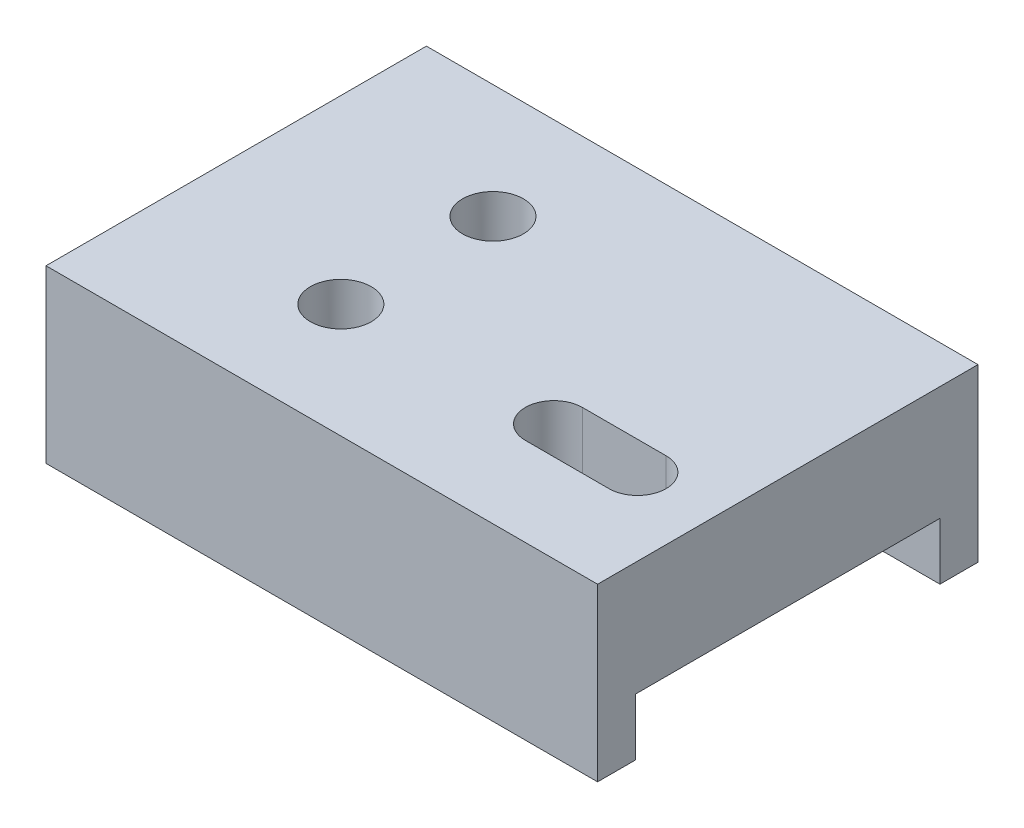
ISO-10303-21;
HEADER;
FILE_DESCRIPTION(('STEP AP214'),'2;1');
FILE_NAME('part.step','',(''),(''),'','','');
FILE_SCHEMA(('AUTOMOTIVE_DESIGN { 1 0 10303 214 1 1 1 1 }'));
ENDSEC;
DATA;
#1=APPLICATION_CONTEXT('core data for automotive mechanical design processes');
#2=APPLICATION_PROTOCOL_DEFINITION('international standard','automotive_design',2000,#1);
#3=PRODUCT_CONTEXT('',#1,'mechanical');
#4=PRODUCT('Part','Part','',(#3));
#5=PRODUCT_RELATED_PRODUCT_CATEGORY('part','',(#4));
#6=PRODUCT_DEFINITION_FORMATION('','',#4);
#7=PRODUCT_DEFINITION_CONTEXT('part definition',#1,'design');
#8=PRODUCT_DEFINITION('design','',#6,#7);
#9=PRODUCT_DEFINITION_SHAPE('','',#8);
#10=(LENGTH_UNIT() NAMED_UNIT(*) SI_UNIT(.MILLI.,.METRE.));
#11=(NAMED_UNIT(*) PLANE_ANGLE_UNIT() SI_UNIT($,.RADIAN.));
#12=(NAMED_UNIT(*) SI_UNIT($,.STERADIAN.) SOLID_ANGLE_UNIT());
#13=UNCERTAINTY_MEASURE_WITH_UNIT(LENGTH_MEASURE(1.E-05),#10,'distance_accuracy_value','');
#14=(GEOMETRIC_REPRESENTATION_CONTEXT(3) GLOBAL_UNCERTAINTY_ASSIGNED_CONTEXT((#13)) GLOBAL_UNIT_ASSIGNED_CONTEXT((#10,
#11,#12)) REPRESENTATION_CONTEXT('',''));
#15=CARTESIAN_POINT('',(0.,0.,0.));
#16=DIRECTION('',(0.,0.,1.));
#17=DIRECTION('',(1.,0.,0.));
#18=AXIS2_PLACEMENT_3D('',#15,#16,#17);
#19=CARTESIAN_POINT('',(11.0500000000395,0.,-6.14999999999984));
#20=DIRECTION('',(0.,-1.,0.));
#21=DIRECTION('',(0.,0.,-1.));
#22=AXIS2_PLACEMENT_3D('',#19,#20,#21);
#23=CYLINDRICAL_SURFACE('',#22,1.5);
#24=DIRECTION('',(0.,-1.,0.));
#25=VECTOR('',#24,1.);
#26=CARTESIAN_POINT('',(11.0500000000395,0.,-4.64999999999984));
#27=LINE('',#26,#25);
#28=CARTESIAN_POINT('',(11.0500000000395,0.,-4.64999999999984));
#29=VERTEX_POINT('',#28);
#30=CARTESIAN_POINT('',(11.0500000000395,-6.,-4.64999999999984));
#31=VERTEX_POINT('',#30);
#32=EDGE_CURVE('E156',#29,#31,#27,.T.);
#33=ORIENTED_EDGE('',*,*,#32,.T.);
#34=CARTESIAN_POINT('',(11.0500000000395,-6.,-6.14999999999984));
#35=DIRECTION('',(0.,-1.,0.));
#36=DIRECTION('',(0.,0.,-1.));
#37=AXIS2_PLACEMENT_3D('',#34,#35,#36);
#38=CIRCLE('',#37,1.5);
#39=CARTESIAN_POINT('',(11.0500000000395,-6.,-7.64999999999984));
#40=VERTEX_POINT('',#39);
#41=EDGE_CURVE('E159',#31,#40,#38,.T.);
#42=ORIENTED_EDGE('',*,*,#41,.T.);
#43=DIRECTION('',(0.,-1.,0.));
#44=VECTOR('',#43,1.);
#45=CARTESIAN_POINT('',(11.0500000000395,0.,-7.64999999999984));
#46=LINE('',#45,#44);
#47=CARTESIAN_POINT('',(11.0500000000395,0.,-7.64999999999984));
#48=VERTEX_POINT('',#47);
#49=EDGE_CURVE('E130',#48,#40,#46,.T.);
#50=ORIENTED_EDGE('',*,*,#49,.F.);
#51=CARTESIAN_POINT('',(11.0500000000395,0.,-6.14999999999984));
#52=DIRECTION('',(0.,-1.,0.));
#53=DIRECTION('',(0.,0.,-1.));
#54=AXIS2_PLACEMENT_3D('',#51,#52,#53);
#55=CIRCLE('',#54,1.5);
#56=EDGE_CURVE('E144',#29,#48,#55,.T.);
#57=ORIENTED_EDGE('',*,*,#56,.F.);
#58=EDGE_LOOP('',(#33,#42,#50,#57));
#59=FACE_BOUND('',#58,.T.);
#60=ADVANCED_FACE('F32',(#59),#23,.F.);
#61=CARTESIAN_POINT('',(9.5,-6.,-20.));
#62=DIRECTION('',(0.,-1.,0.));
#63=DIRECTION('',(0.,0.,-1.));
#64=AXIS2_PLACEMENT_3D('',#61,#62,#63);
#65=PLANE('',#64);
#66=CARTESIAN_POINT('',(0.,-6.,-6.00000000000006));
#67=DIRECTION('',(0.,-1.,0.));
#68=DIRECTION('',(0.,0.,-1.));
#69=AXIS2_PLACEMENT_3D('',#66,#67,#68);
#70=CIRCLE('',#69,3.);
#71=CARTESIAN_POINT('',(0.,-6.,-3.00000000000006));
#72=VERTEX_POINT('',#71);
#73=EDGE_CURVE('E36',#72,#72,#70,.T.);
#74=ORIENTED_EDGE('',*,*,#73,.F.);
#75=EDGE_LOOP('',(#74));
#76=FACE_BOUND('',#75,.T.);
#77=DIRECTION('',(-1.,0.,0.));
#78=VECTOR('',#77,1.);
#79=CARTESIAN_POINT('',(11.0500000000395,-6.,-4.64999999999984));
#80=LINE('',#79,#78);
#81=CARTESIAN_POINT('',(15.4500557523161,-6.,-4.64999999999984));
#82=VERTEX_POINT('',#81);
#83=EDGE_CURVE('E145',#82,#31,#80,.T.);
#84=ORIENTED_EDGE('',*,*,#83,.F.);
#85=CARTESIAN_POINT('',(15.4500557523161,-6.,-6.14999999999984));
#86=DIRECTION('',(0.,-1.,0.));
#87=DIRECTION('',(0.,0.,-1.));
#88=AXIS2_PLACEMENT_3D('',#85,#86,#87);
#89=CIRCLE('',#88,1.5);
#90=CARTESIAN_POINT('',(15.4500557523161,-6.,-7.64999999999984));
#91=VERTEX_POINT('',#90);
#92=EDGE_CURVE('E147',#91,#82,#89,.T.);
#93=ORIENTED_EDGE('',*,*,#92,.F.);
#94=DIRECTION('',(1.,0.,0.));
#95=VECTOR('',#94,1.);
#96=CARTESIAN_POINT('',(11.0500000000395,-6.,-7.64999999999984));
#97=LINE('',#96,#95);
#98=EDGE_CURVE('E125',#40,#91,#97,.T.);
#99=ORIENTED_EDGE('',*,*,#98,.F.);
#100=ORIENTED_EDGE('',*,*,#41,.F.);
#101=EDGE_LOOP('',(#84,#93,#99,#100));
#102=FACE_BOUND('',#101,.T.);
#103=CARTESIAN_POINT('',(0.,-6.,-14.0000000000001));
#104=DIRECTION('',(0.,-1.,0.));
#105=DIRECTION('',(0.,0.,-1.));
#106=AXIS2_PLACEMENT_3D('',#103,#104,#105);
#107=CIRCLE('',#106,3.);
#108=CARTESIAN_POINT('',(0.,-6.,-17.0000000000001));
#109=VERTEX_POINT('',#108);
#110=EDGE_CURVE('E220',#109,#109,#107,.T.);
#111=ORIENTED_EDGE('',*,*,#110,.F.);
#112=EDGE_LOOP('',(#111));
#113=FACE_BOUND('',#112,.T.);
#114=DIRECTION('',(0.,0.,1.));
#115=VECTOR('',#114,1.);
#116=CARTESIAN_POINT('',(-9.5,-6.,-20.));
#117=LINE('',#116,#115);
#118=CARTESIAN_POINT('',(-9.5,-6.,-18.));
#119=VERTEX_POINT('',#118);
#120=CARTESIAN_POINT('',(-9.5,-6.,-2.00000000000002));
#121=VERTEX_POINT('',#120);
#122=EDGE_CURVE('E222',#119,#121,#117,.T.);
#123=ORIENTED_EDGE('',*,*,#122,.F.);
#124=DIRECTION('',(-1.,0.,0.));
#125=VECTOR('',#124,1.);
#126=CARTESIAN_POINT('',(-9.5,-6.,-18.));
#127=LINE('',#126,#125);
#128=CARTESIAN_POINT('',(19.5,-6.,-18.));
#129=VERTEX_POINT('',#128);
#130=EDGE_CURVE('E189',#129,#119,#127,.T.);
#131=ORIENTED_EDGE('',*,*,#130,.F.);
#132=DIRECTION('',(0.,0.,-1.));
#133=VECTOR('',#132,1.);
#134=CARTESIAN_POINT('',(19.5,-6.,-2.00000000000002));
#135=LINE('',#134,#133);
#136=CARTESIAN_POINT('',(19.5,-6.,-2.00000000000002));
#137=VERTEX_POINT('',#136);
#138=EDGE_CURVE('E177',#137,#129,#135,.T.);
#139=ORIENTED_EDGE('',*,*,#138,.F.);
#140=DIRECTION('',(1.,0.,0.));
#141=VECTOR('',#140,1.);
#142=CARTESIAN_POINT('',(-9.5,-6.,-2.00000000000002));
#143=LINE('',#142,#141);
#144=EDGE_CURVE('E199',#121,#137,#143,.T.);
#145=ORIENTED_EDGE('',*,*,#144,.F.);
#146=EDGE_LOOP('',(#123,#131,#139,#145));
#147=FACE_BOUND('',#146,.T.);
#148=ADVANCED_FACE('F257',(#76,#102,#113,#147),#65,.T.);
#149=CARTESIAN_POINT('',(9.5,0.,0.));
#150=DIRECTION('',(0.,0.,-1.));
#151=DIRECTION('',(0.,1.,0.));
#152=AXIS2_PLACEMENT_3D('',#149,#150,#151);
#153=PLANE('',#152);
#154=DIRECTION('',(0.,-1.,0.));
#155=VECTOR('',#154,1.);
#156=CARTESIAN_POINT('',(-9.5,0.,0.));
#157=LINE('',#156,#155);
#158=CARTESIAN_POINT('',(-9.5,0.,0.));
#159=VERTEX_POINT('',#158);
#160=CARTESIAN_POINT('',(-9.5,-9.,0.));
#161=VERTEX_POINT('',#160);
#162=EDGE_CURVE('E219',#159,#161,#157,.T.);
#163=ORIENTED_EDGE('',*,*,#162,.T.);
#164=DIRECTION('',(-1.,0.,0.));
#165=VECTOR('',#164,1.);
#166=CARTESIAN_POINT('',(-9.5,-9.,0.));
#167=LINE('',#166,#165);
#168=CARTESIAN_POINT('',(19.5,-9.,0.));
#169=VERTEX_POINT('',#168);
#170=EDGE_CURVE('E205',#169,#161,#167,.T.);
#171=ORIENTED_EDGE('',*,*,#170,.F.);
#172=DIRECTION('',(0.,-1.,0.));
#173=VECTOR('',#172,1.);
#174=CARTESIAN_POINT('',(19.5,0.,0.));
#175=LINE('',#174,#173);
#176=CARTESIAN_POINT('',(19.5,0.,0.));
#177=VERTEX_POINT('',#176);
#178=EDGE_CURVE('E168',#177,#169,#175,.T.);
#179=ORIENTED_EDGE('',*,*,#178,.F.);
#180=DIRECTION('',(-1.,0.,0.));
#181=VECTOR('',#180,1.);
#182=CARTESIAN_POINT('',(9.5,0.,0.));
#183=LINE('',#182,#181);
#184=EDGE_CURVE('E41',#177,#159,#183,.T.);
#185=ORIENTED_EDGE('',*,*,#184,.T.);
#186=EDGE_LOOP('',(#163,#171,#179,#185));
#187=FACE_BOUND('',#186,.T.);
#188=ADVANCED_FACE('F34',(#187),#153,.F.);
#189=CARTESIAN_POINT('',(9.5,0.,-20.));
#190=DIRECTION('',(0.,0.,-1.));
#191=DIRECTION('',(-1.,0.,0.));
#192=AXIS2_PLACEMENT_3D('',#189,#190,#191);
#193=PLANE('',#192);
#194=DIRECTION('',(0.,-1.,0.));
#195=VECTOR('',#194,1.);
#196=CARTESIAN_POINT('',(-9.5,0.,-20.));
#197=LINE('',#196,#195);
#198=CARTESIAN_POINT('',(-9.5,0.,-20.));
#199=VERTEX_POINT('',#198);
#200=CARTESIAN_POINT('',(-9.5,-9.,-20.));
#201=VERTEX_POINT('',#200);
#202=EDGE_CURVE('E224',#199,#201,#197,.T.);
#203=ORIENTED_EDGE('',*,*,#202,.F.);
#204=DIRECTION('',(-1.,0.,0.));
#205=VECTOR('',#204,1.);
#206=CARTESIAN_POINT('',(9.5,0.,-20.));
#207=LINE('',#206,#205);
#208=CARTESIAN_POINT('',(19.5,0.,-20.));
#209=VERTEX_POINT('',#208);
#210=EDGE_CURVE('E11',#209,#199,#207,.T.);
#211=ORIENTED_EDGE('',*,*,#210,.F.);
#212=DIRECTION('',(0.,1.,0.));
#213=VECTOR('',#212,1.);
#214=CARTESIAN_POINT('',(19.5,-9.,-20.));
#215=LINE('',#214,#213);
#216=CARTESIAN_POINT('',(19.5,-9.,-20.));
#217=VERTEX_POINT('',#216);
#218=EDGE_CURVE('E186',#217,#209,#215,.T.);
#219=ORIENTED_EDGE('',*,*,#218,.F.);
#220=DIRECTION('',(1.,0.,0.));
#221=VECTOR('',#220,1.);
#222=CARTESIAN_POINT('',(-9.5,-9.,-20.));
#223=LINE('',#222,#221);
#224=EDGE_CURVE('E193',#201,#217,#223,.T.);
#225=ORIENTED_EDGE('',*,*,#224,.F.);
#226=EDGE_LOOP('',(#203,#211,#219,#225));
#227=FACE_BOUND('',#226,.T.);
#228=ADVANCED_FACE('F306',(#227),#193,.T.);
#229=CARTESIAN_POINT('',(9.5,0.,-20.));
#230=DIRECTION('',(0.,-1.,0.));
#231=DIRECTION('',(0.,0.,-1.));
#232=AXIS2_PLACEMENT_3D('',#229,#230,#231);
#233=PLANE('',#232);
#234=CARTESIAN_POINT('',(0.,0.,-6.00000000000006));
#235=DIRECTION('',(0.,1.,0.));
#236=DIRECTION('',(0.,0.,-1.));
#237=AXIS2_PLACEMENT_3D('',#234,#235,#236);
#238=CIRCLE('',#237,1.6);
#239=CARTESIAN_POINT('',(0.,0.,-7.60000000000006));
#240=VERTEX_POINT('',#239);
#241=EDGE_CURVE('E150',#240,#240,#238,.T.);
#242=ORIENTED_EDGE('',*,*,#241,.F.);
#243=EDGE_LOOP('',(#242));
#244=FACE_BOUND('',#243,.T.);
#245=CARTESIAN_POINT('',(15.4500557523161,0.,-6.14999999999984));
#246=DIRECTION('',(0.,-1.,0.));
#247=DIRECTION('',(0.,0.,-1.));
#248=AXIS2_PLACEMENT_3D('',#245,#246,#247);
#249=CIRCLE('',#248,1.5);
#250=CARTESIAN_POINT('',(15.4500557523161,0.,-7.64999999999984));
#251=VERTEX_POINT('',#250);
#252=CARTESIAN_POINT('',(15.4500557523161,0.,-4.64999999999984));
#253=VERTEX_POINT('',#252);
#254=EDGE_CURVE('E133',#251,#253,#249,.T.);
#255=ORIENTED_EDGE('',*,*,#254,.T.);
#256=DIRECTION('',(-1.,0.,0.));
#257=VECTOR('',#256,1.);
#258=CARTESIAN_POINT('',(11.0500000000395,0.,-4.64999999999984));
#259=LINE('',#258,#257);
#260=EDGE_CURVE('E138',#253,#29,#259,.T.);
#261=ORIENTED_EDGE('',*,*,#260,.T.);
#262=ORIENTED_EDGE('',*,*,#56,.T.);
#263=DIRECTION('',(1.,0.,0.));
#264=VECTOR('',#263,1.);
#265=CARTESIAN_POINT('',(11.0500000000395,0.,-7.64999999999984));
#266=LINE('',#265,#264);
#267=EDGE_CURVE('E49',#48,#251,#266,.T.);
#268=ORIENTED_EDGE('',*,*,#267,.T.);
#269=EDGE_LOOP('',(#255,#261,#262,#268));
#270=FACE_BOUND('',#269,.T.);
#271=CARTESIAN_POINT('',(0.,0.,-14.0000000000001));
#272=DIRECTION('',(0.,1.,0.));
#273=DIRECTION('',(0.,0.,-1.));
#274=AXIS2_PLACEMENT_3D('',#271,#272,#273);
#275=CIRCLE('',#274,1.6);
#276=CARTESIAN_POINT('',(0.,0.,-15.6000000000001));
#277=VERTEX_POINT('',#276);
#278=EDGE_CURVE('E216',#277,#277,#275,.T.);
#279=ORIENTED_EDGE('',*,*,#278,.F.);
#280=EDGE_LOOP('',(#279));
#281=FACE_BOUND('',#280,.T.);
#282=DIRECTION('',(0.,0.,1.));
#283=VECTOR('',#282,1.);
#284=CARTESIAN_POINT('',(-9.5,0.,-20.));
#285=LINE('',#284,#283);
#286=EDGE_CURVE('E226',#199,#159,#285,.T.);
#287=ORIENTED_EDGE('',*,*,#286,.T.);
#288=ORIENTED_EDGE('',*,*,#184,.F.);
#289=DIRECTION('',(0.,0.,1.));
#290=VECTOR('',#289,1.);
#291=CARTESIAN_POINT('',(19.5,0.,-20.));
#292=LINE('',#291,#290);
#293=EDGE_CURVE('E163',#209,#177,#292,.T.);
#294=ORIENTED_EDGE('',*,*,#293,.F.);
#295=ORIENTED_EDGE('',*,*,#210,.T.);
#296=EDGE_LOOP('',(#287,#288,#294,#295));
#297=FACE_BOUND('',#296,.T.);
#298=ADVANCED_FACE('F141',(#244,#270,#281,#297),#233,.F.);
#299=CARTESIAN_POINT('',(-9.5,0.,0.));
#300=DIRECTION('',(-1.,0.,0.));
#301=DIRECTION('',(0.,0.,1.));
#302=AXIS2_PLACEMENT_3D('',#299,#300,#301);
#303=PLANE('',#302);
#304=ORIENTED_EDGE('',*,*,#202,.T.);
#305=DIRECTION('',(0.,0.,-1.));
#306=VECTOR('',#305,1.);
#307=CARTESIAN_POINT('',(-9.5,-9.,-20.));
#308=LINE('',#307,#306);
#309=CARTESIAN_POINT('',(-9.5,-9.,-18.));
#310=VERTEX_POINT('',#309);
#311=EDGE_CURVE('E190',#310,#201,#308,.T.);
#312=ORIENTED_EDGE('',*,*,#311,.F.);
#313=DIRECTION('',(0.,1.,0.));
#314=VECTOR('',#313,1.);
#315=CARTESIAN_POINT('',(-9.5,-9.,-18.));
#316=LINE('',#315,#314);
#317=EDGE_CURVE('E57',#310,#119,#316,.T.);
#318=ORIENTED_EDGE('',*,*,#317,.T.);
#319=ORIENTED_EDGE('',*,*,#122,.T.);
#320=DIRECTION('',(0.,1.,0.));
#321=VECTOR('',#320,1.);
#322=CARTESIAN_POINT('',(-9.5,-9.,-2.00000000000002));
#323=LINE('',#322,#321);
#324=CARTESIAN_POINT('',(-9.5,-9.,-2.00000000000002));
#325=VERTEX_POINT('',#324);
#326=EDGE_CURVE('E208',#325,#121,#323,.T.);
#327=ORIENTED_EDGE('',*,*,#326,.F.);
#328=DIRECTION('',(0.,0.,-1.));
#329=VECTOR('',#328,1.);
#330=CARTESIAN_POINT('',(-9.5,-9.,0.));
#331=LINE('',#330,#329);
#332=EDGE_CURVE('E200',#161,#325,#331,.T.);
#333=ORIENTED_EDGE('',*,*,#332,.F.);
#334=ORIENTED_EDGE('',*,*,#162,.F.);
#335=ORIENTED_EDGE('',*,*,#286,.F.);
#336=EDGE_LOOP('',(#304,#312,#318,#319,#327,#333,#334,#335));
#337=FACE_BOUND('',#336,.T.);
#338=ADVANCED_FACE('F300',(#337),#303,.T.);
#339=CARTESIAN_POINT('',(0.,-14.,-14.0000000000001));
#340=DIRECTION('',(0.,1.,0.));
#341=DIRECTION('',(0.,0.,1.));
#342=AXIS2_PLACEMENT_3D('',#339,#340,#341);
#343=CYLINDRICAL_SURFACE('',#342,1.6);
#344=CARTESIAN_POINT('',(0.,-2.5,-14.0000000000001));
#345=DIRECTION('',(0.,1.,0.));
#346=DIRECTION('',(0.,0.,1.));
#347=AXIS2_PLACEMENT_3D('',#344,#345,#346);
#348=CIRCLE('',#347,1.6);
#349=CARTESIAN_POINT('',(0.,-2.5,-12.4000000000001));
#350=VERTEX_POINT('',#349);
#351=EDGE_CURVE('E215',#350,#350,#348,.F.);
#352=ORIENTED_EDGE('',*,*,#351,.T.);
#353=EDGE_LOOP('',(#352));
#354=FACE_BOUND('',#353,.T.);
#355=ORIENTED_EDGE('',*,*,#278,.T.);
#356=EDGE_LOOP('',(#355));
#357=FACE_BOUND('',#356,.T.);
#358=ADVANCED_FACE('F293',(#354,#357),#343,.F.);
#359=CARTESIAN_POINT('',(0.,-2.5,-14.0000000000001));
#360=DIRECTION('',(0.,1.,0.));
#361=DIRECTION('',(0.,0.,1.));
#362=AXIS2_PLACEMENT_3D('',#359,#360,#361);
#363=PLANE('',#362);
#364=CARTESIAN_POINT('',(0.,-2.5,-14.0000000000001));
#365=DIRECTION('',(0.,1.,0.));
#366=DIRECTION('',(0.,0.,1.));
#367=AXIS2_PLACEMENT_3D('',#364,#365,#366);
#368=CIRCLE('',#367,3.);
#369=CARTESIAN_POINT('',(0.,-2.5,-11.0000000000001));
#370=VERTEX_POINT('',#369);
#371=EDGE_CURVE('E212',#370,#370,#368,.T.);
#372=ORIENTED_EDGE('',*,*,#371,.F.);
#373=EDGE_LOOP('',(#372));
#374=FACE_BOUND('',#373,.T.);
#375=ORIENTED_EDGE('',*,*,#351,.F.);
#376=EDGE_LOOP('',(#375));
#377=FACE_BOUND('',#376,.T.);
#378=ADVANCED_FACE('F290',(#374,#377),#363,.F.);
#379=CARTESIAN_POINT('',(0.,-14.,-14.0000000000001));
#380=DIRECTION('',(0.,1.,0.));
#381=DIRECTION('',(0.,0.,1.));
#382=AXIS2_PLACEMENT_3D('',#379,#380,#381);
#383=CYLINDRICAL_SURFACE('',#382,3.);
#384=ORIENTED_EDGE('',*,*,#110,.T.);
#385=EDGE_LOOP('',(#384));
#386=FACE_BOUND('',#385,.T.);
#387=ORIENTED_EDGE('',*,*,#371,.T.);
#388=EDGE_LOOP('',(#387));
#389=FACE_BOUND('',#388,.T.);
#390=ADVANCED_FACE('F288',(#386,#389),#383,.F.);
#391=CARTESIAN_POINT('',(-9.5,-9.,-2.00000000000002));
#392=DIRECTION('',(0.,0.,1.));
#393=DIRECTION('',(0.,-1.,0.));
#394=AXIS2_PLACEMENT_3D('',#391,#392,#393);
#395=PLANE('',#394);
#396=ORIENTED_EDGE('',*,*,#144,.T.);
#397=DIRECTION('',(0.,1.,0.));
#398=VECTOR('',#397,1.);
#399=CARTESIAN_POINT('',(19.5,-9.,-2.00000000000002));
#400=LINE('',#399,#398);
#401=CARTESIAN_POINT('',(19.5,-9.,-2.00000000000002));
#402=VERTEX_POINT('',#401);
#403=EDGE_CURVE('E174',#402,#137,#400,.T.);
#404=ORIENTED_EDGE('',*,*,#403,.F.);
#405=DIRECTION('',(1.,0.,0.));
#406=VECTOR('',#405,1.);
#407=CARTESIAN_POINT('',(-9.5,-9.,-2.00000000000002));
#408=LINE('',#407,#406);
#409=EDGE_CURVE('E203',#325,#402,#408,.T.);
#410=ORIENTED_EDGE('',*,*,#409,.F.);
#411=ORIENTED_EDGE('',*,*,#326,.T.);
#412=EDGE_LOOP('',(#396,#404,#410,#411));
#413=FACE_BOUND('',#412,.T.);
#414=ADVANCED_FACE('F284',(#413),#395,.F.);
#415=CARTESIAN_POINT('',(0.,-9.,0.));
#416=DIRECTION('',(0.,-1.,0.));
#417=DIRECTION('',(0.,0.,-1.));
#418=AXIS2_PLACEMENT_3D('',#415,#416,#417);
#419=PLANE('',#418);
#420=ORIENTED_EDGE('',*,*,#332,.T.);
#421=ORIENTED_EDGE('',*,*,#409,.T.);
#422=DIRECTION('',(0.,0.,-1.));
#423=VECTOR('',#422,1.);
#424=CARTESIAN_POINT('',(19.5,-9.,0.));
#425=LINE('',#424,#423);
#426=EDGE_CURVE('E171',#169,#402,#425,.T.);
#427=ORIENTED_EDGE('',*,*,#426,.F.);
#428=ORIENTED_EDGE('',*,*,#170,.T.);
#429=EDGE_LOOP('',(#420,#421,#427,#428));
#430=FACE_BOUND('',#429,.T.);
#431=ADVANCED_FACE('F280',(#430),#419,.T.);
#432=CARTESIAN_POINT('',(-9.5,-9.,-18.));
#433=DIRECTION('',(0.,0.,-1.));
#434=DIRECTION('',(0.,1.,0.));
#435=AXIS2_PLACEMENT_3D('',#432,#433,#434);
#436=PLANE('',#435);
#437=ORIENTED_EDGE('',*,*,#130,.T.);
#438=ORIENTED_EDGE('',*,*,#317,.F.);
#439=DIRECTION('',(-1.,0.,0.));
#440=VECTOR('',#439,1.);
#441=CARTESIAN_POINT('',(-9.5,-9.,-18.));
#442=LINE('',#441,#440);
#443=CARTESIAN_POINT('',(19.5,-9.,-18.));
#444=VERTEX_POINT('',#443);
#445=EDGE_CURVE('E195',#444,#310,#442,.T.);
#446=ORIENTED_EDGE('',*,*,#445,.F.);
#447=DIRECTION('',(0.,-1.,0.));
#448=VECTOR('',#447,1.);
#449=CARTESIAN_POINT('',(19.5,-6.,-18.));
#450=LINE('',#449,#448);
#451=EDGE_CURVE('E180',#129,#444,#450,.T.);
#452=ORIENTED_EDGE('',*,*,#451,.F.);
#453=EDGE_LOOP('',(#437,#438,#446,#452));
#454=FACE_BOUND('',#453,.T.);
#455=ADVANCED_FACE('F276',(#454),#436,.F.);
#456=CARTESIAN_POINT('',(0.,-9.,0.));
#457=DIRECTION('',(0.,1.,0.));
#458=DIRECTION('',(0.,0.,1.));
#459=AXIS2_PLACEMENT_3D('',#456,#457,#458);
#460=PLANE('',#459);
#461=ORIENTED_EDGE('',*,*,#311,.T.);
#462=ORIENTED_EDGE('',*,*,#224,.T.);
#463=DIRECTION('',(0.,0.,-1.));
#464=VECTOR('',#463,1.);
#465=CARTESIAN_POINT('',(19.5,-9.,-18.));
#466=LINE('',#465,#464);
#467=EDGE_CURVE('E183',#444,#217,#466,.T.);
#468=ORIENTED_EDGE('',*,*,#467,.F.);
#469=ORIENTED_EDGE('',*,*,#445,.T.);
#470=EDGE_LOOP('',(#461,#462,#468,#469));
#471=FACE_BOUND('',#470,.T.);
#472=ADVANCED_FACE('F272',(#471),#460,.F.);
#473=CARTESIAN_POINT('',(19.5,0.,0.));
#474=DIRECTION('',(1.,0.,0.));
#475=DIRECTION('',(0.,0.,-1.));
#476=AXIS2_PLACEMENT_3D('',#473,#474,#475);
#477=PLANE('',#476);
#478=ORIENTED_EDGE('',*,*,#293,.T.);
#479=ORIENTED_EDGE('',*,*,#178,.T.);
#480=ORIENTED_EDGE('',*,*,#426,.T.);
#481=ORIENTED_EDGE('',*,*,#403,.T.);
#482=ORIENTED_EDGE('',*,*,#138,.T.);
#483=ORIENTED_EDGE('',*,*,#451,.T.);
#484=ORIENTED_EDGE('',*,*,#467,.T.);
#485=ORIENTED_EDGE('',*,*,#218,.T.);
#486=EDGE_LOOP('',(#478,#479,#480,#481,#482,#483,#484,#485));
#487=FACE_BOUND('',#486,.T.);
#488=ADVANCED_FACE('F269',(#487),#477,.T.);
#489=CARTESIAN_POINT('',(11.0500000000395,0.,-4.64999999999984));
#490=DIRECTION('',(0.,0.,1.));
#491=DIRECTION('',(0.,-1.,0.));
#492=AXIS2_PLACEMENT_3D('',#489,#490,#491);
#493=PLANE('',#492);
#494=ORIENTED_EDGE('',*,*,#83,.T.);
#495=ORIENTED_EDGE('',*,*,#32,.F.);
#496=ORIENTED_EDGE('',*,*,#260,.F.);
#497=DIRECTION('',(0.,-1.,0.));
#498=VECTOR('',#497,1.);
#499=CARTESIAN_POINT('',(15.4500557523161,0.,-4.64999999999984));
#500=LINE('',#499,#498);
#501=EDGE_CURVE('E129',#253,#82,#500,.T.);
#502=ORIENTED_EDGE('',*,*,#501,.T.);
#503=EDGE_LOOP('',(#494,#495,#496,#502));
#504=FACE_BOUND('',#503,.T.);
#505=ADVANCED_FACE('F271',(#504),#493,.F.);
#506=CARTESIAN_POINT('',(15.4500557523161,0.,-6.14999999999984));
#507=DIRECTION('',(0.,-1.,0.));
#508=DIRECTION('',(0.,0.,-1.));
#509=AXIS2_PLACEMENT_3D('',#506,#507,#508);
#510=CYLINDRICAL_SURFACE('',#509,1.5);
#511=ORIENTED_EDGE('',*,*,#92,.T.);
#512=ORIENTED_EDGE('',*,*,#501,.F.);
#513=ORIENTED_EDGE('',*,*,#254,.F.);
#514=DIRECTION('',(0.,-1.,0.));
#515=VECTOR('',#514,1.);
#516=CARTESIAN_POINT('',(15.4500557523161,0.,-7.64999999999984));
#517=LINE('',#516,#515);
#518=EDGE_CURVE('E121',#251,#91,#517,.T.);
#519=ORIENTED_EDGE('',*,*,#518,.T.);
#520=EDGE_LOOP('',(#511,#512,#513,#519));
#521=FACE_BOUND('',#520,.T.);
#522=ADVANCED_FACE('F134',(#521),#510,.F.);
#523=CARTESIAN_POINT('',(11.0500000000395,0.,-7.64999999999984));
#524=DIRECTION('',(0.,0.,-1.));
#525=DIRECTION('',(0.,1.,0.));
#526=AXIS2_PLACEMENT_3D('',#523,#524,#525);
#527=PLANE('',#526);
#528=ORIENTED_EDGE('',*,*,#98,.T.);
#529=ORIENTED_EDGE('',*,*,#518,.F.);
#530=ORIENTED_EDGE('',*,*,#267,.F.);
#531=ORIENTED_EDGE('',*,*,#49,.T.);
#532=EDGE_LOOP('',(#528,#529,#530,#531));
#533=FACE_BOUND('',#532,.T.);
#534=ADVANCED_FACE('F123',(#533),#527,.F.);
#535=CARTESIAN_POINT('',(0.,-9.,-6.00000000000006));
#536=DIRECTION('',(0.,1.,0.));
#537=DIRECTION('',(0.,0.,1.));
#538=AXIS2_PLACEMENT_3D('',#535,#536,#537);
#539=CYLINDRICAL_SURFACE('',#538,1.6);
#540=CARTESIAN_POINT('',(0.,-2.5,-6.00000000000006));
#541=DIRECTION('',(0.,1.,0.));
#542=DIRECTION('',(0.,0.,1.));
#543=AXIS2_PLACEMENT_3D('',#540,#541,#542);
#544=CIRCLE('',#543,1.6);
#545=CARTESIAN_POINT('',(0.,-2.5,-4.40000000000005));
#546=VERTEX_POINT('',#545);
#547=EDGE_CURVE('E233',#546,#546,#544,.F.);
#548=ORIENTED_EDGE('',*,*,#547,.T.);
#549=EDGE_LOOP('',(#548));
#550=FACE_BOUND('',#549,.T.);
#551=ORIENTED_EDGE('',*,*,#241,.T.);
#552=EDGE_LOOP('',(#551));
#553=FACE_BOUND('',#552,.T.);
#554=ADVANCED_FACE('F247',(#550,#553),#539,.F.);
#555=CARTESIAN_POINT('',(0.,-2.5,-6.00000000000006));
#556=DIRECTION('',(0.,1.,0.));
#557=DIRECTION('',(0.,0.,1.));
#558=AXIS2_PLACEMENT_3D('',#555,#556,#557);
#559=PLANE('',#558);
#560=CARTESIAN_POINT('',(0.,-2.5,-6.00000000000006));
#561=DIRECTION('',(0.,1.,0.));
#562=DIRECTION('',(0.,0.,1.));
#563=AXIS2_PLACEMENT_3D('',#560,#561,#562);
#564=CIRCLE('',#563,3.);
#565=CARTESIAN_POINT('',(0.,-2.5,-3.00000000000006));
#566=VERTEX_POINT('',#565);
#567=EDGE_CURVE('E235',#566,#566,#564,.T.);
#568=ORIENTED_EDGE('',*,*,#567,.F.);
#569=EDGE_LOOP('',(#568));
#570=FACE_BOUND('',#569,.T.);
#571=ORIENTED_EDGE('',*,*,#547,.F.);
#572=EDGE_LOOP('',(#571));
#573=FACE_BOUND('',#572,.T.);
#574=ADVANCED_FACE('F244',(#570,#573),#559,.F.);
#575=CARTESIAN_POINT('',(0.,-9.,-6.00000000000006));
#576=DIRECTION('',(0.,1.,0.));
#577=DIRECTION('',(0.,0.,1.));
#578=AXIS2_PLACEMENT_3D('',#575,#576,#577);
#579=CYLINDRICAL_SURFACE('',#578,3.);
#580=CARTESIAN_POINT('',(0.,-6.,-3.00000000000006));
#581=CARTESIAN_POINT('',(0.,-5.96354166666667,-3.00000000000006));
#582=CARTESIAN_POINT('',(0.,-5.92708333333333,-3.00000000000006));
#583=CARTESIAN_POINT('',(0.,-5.85416666666667,-3.00000000000006));
#584=CARTESIAN_POINT('',(0.,-5.81770833333333,-3.00000000000006));
#585=CARTESIAN_POINT('',(0.,-5.74479166666667,-3.00000000000006));
#586=CARTESIAN_POINT('',(0.,-5.70833333333333,-3.00000000000006));
#587=CARTESIAN_POINT('',(0.,-5.63541666666667,-3.00000000000006));
#588=CARTESIAN_POINT('',(0.,-5.59895833333333,-3.00000000000006));
#589=CARTESIAN_POINT('',(0.,-5.52604166666667,-3.00000000000006));
#590=CARTESIAN_POINT('',(0.,-5.48958333333333,-3.00000000000006));
#591=CARTESIAN_POINT('',(0.,-5.41666666666667,-3.00000000000006));
#592=CARTESIAN_POINT('',(0.,-5.38020833333333,-3.00000000000006));
#593=CARTESIAN_POINT('',(0.,-5.30729166666667,-3.00000000000006));
#594=CARTESIAN_POINT('',(0.,-5.27083333333333,-3.00000000000006));
#595=CARTESIAN_POINT('',(0.,-5.19791666666667,-3.00000000000006));
#596=CARTESIAN_POINT('',(0.,-5.16145833333333,-3.00000000000006));
#597=CARTESIAN_POINT('',(0.,-5.08854166666667,-3.00000000000006));
#598=CARTESIAN_POINT('',(0.,-5.05208333333333,-3.00000000000006));
#599=CARTESIAN_POINT('',(0.,-4.97916666666667,-3.00000000000006));
#600=CARTESIAN_POINT('',(0.,-4.94270833333334,-3.00000000000006));
#601=CARTESIAN_POINT('',(0.,-4.86979166666667,-3.00000000000006));
#602=CARTESIAN_POINT('',(0.,-4.83333333333334,-3.00000000000006));
#603=CARTESIAN_POINT('',(0.,-4.76041666666667,-3.00000000000006));
#604=CARTESIAN_POINT('',(0.,-4.72395833333333,-3.00000000000006));
#605=CARTESIAN_POINT('',(0.,-4.65104166666667,-3.00000000000006));
#606=CARTESIAN_POINT('',(0.,-4.61458333333333,-3.00000000000006));
#607=CARTESIAN_POINT('',(0.,-4.54166666666667,-3.00000000000006));
#608=CARTESIAN_POINT('',(0.,-4.50520833333333,-3.00000000000006));
#609=CARTESIAN_POINT('',(0.,-4.43229166666667,-3.00000000000006));
#610=CARTESIAN_POINT('',(0.,-4.39583333333333,-3.00000000000006));
#611=CARTESIAN_POINT('',(0.,-4.32291666666667,-3.00000000000006));
#612=CARTESIAN_POINT('',(0.,-4.28645833333334,-3.00000000000006));
#613=CARTESIAN_POINT('',(0.,-4.21354166666667,-3.00000000000006));
#614=CARTESIAN_POINT('',(0.,-4.17708333333334,-3.00000000000006));
#615=CARTESIAN_POINT('',(0.,-4.10416666666667,-3.00000000000006));
#616=CARTESIAN_POINT('',(0.,-4.06770833333334,-3.00000000000006));
#617=CARTESIAN_POINT('',(0.,-3.99479166666667,-3.00000000000006));
#618=CARTESIAN_POINT('',(0.,-3.95833333333334,-3.00000000000006));
#619=CARTESIAN_POINT('',(0.,-3.88541666666667,-3.00000000000006));
#620=CARTESIAN_POINT('',(0.,-3.84895833333334,-3.00000000000006));
#621=CARTESIAN_POINT('',(0.,-3.77604166666667,-3.00000000000006));
#622=CARTESIAN_POINT('',(0.,-3.73958333333334,-3.00000000000006));
#623=CARTESIAN_POINT('',(0.,-3.66666666666667,-3.00000000000006));
#624=CARTESIAN_POINT('',(0.,-3.63020833333334,-3.00000000000006));
#625=CARTESIAN_POINT('',(0.,-3.55729166666667,-3.00000000000006));
#626=CARTESIAN_POINT('',(0.,-3.52083333333334,-3.00000000000006));
#627=CARTESIAN_POINT('',(0.,-3.44791666666667,-3.00000000000006));
#628=CARTESIAN_POINT('',(0.,-3.41145833333334,-3.00000000000006));
#629=CARTESIAN_POINT('',(0.,-3.33854166666667,-3.00000000000006));
#630=CARTESIAN_POINT('',(0.,-3.30208333333334,-3.00000000000006));
#631=CARTESIAN_POINT('',(0.,-3.22916666666667,-3.00000000000006));
#632=CARTESIAN_POINT('',(0.,-3.19270833333334,-3.00000000000006));
#633=CARTESIAN_POINT('',(0.,-3.11979166666667,-3.00000000000006));
#634=CARTESIAN_POINT('',(0.,-3.08333333333334,-3.00000000000006));
#635=CARTESIAN_POINT('',(0.,-3.01041666666667,-3.00000000000006));
#636=CARTESIAN_POINT('',(0.,-2.97395833333334,-3.00000000000006));
#637=CARTESIAN_POINT('',(0.,-2.90104166666667,-3.00000000000006));
#638=CARTESIAN_POINT('',(0.,-2.86458333333334,-3.00000000000006));
#639=CARTESIAN_POINT('',(0.,-2.79166666666667,-3.00000000000006));
#640=CARTESIAN_POINT('',(0.,-2.75520833333334,-3.00000000000006));
#641=CARTESIAN_POINT('',(0.,-2.68229166666667,-3.00000000000006));
#642=CARTESIAN_POINT('',(0.,-2.64583333333334,-3.00000000000006));
#643=CARTESIAN_POINT('',(0.,-2.57291666666667,-3.00000000000006));
#644=CARTESIAN_POINT('',(0.,-2.53645833333334,-3.00000000000006));
#645=CARTESIAN_POINT('',(0.,-2.5,-3.00000000000006));
#646=B_SPLINE_CURVE_WITH_KNOTS('',3,(#580,#581,#582,#583,#584,#585,#586,#587,#588,#589,#590,
#591,#592,#593,#594,#595,#596,#597,#598,#599,#600,#601,#602,#603,#604,#605,#606,#607,#608,#609,
#610,#611,#612,#613,#614,#615,#616,#617,#618,#619,#620,#621,#622,#623,#624,#625,#626,#627,#628,
#629,#630,#631,#632,#633,#634,#635,#636,#637,#638,#639,#640,#641,#642,#643,#644,#645),
.UNSPECIFIED.,.F.,.F.,(4,2,2,2,2,2,2,2,2,2,2,2,2,2,2,2,2,2,2,2,2,2,2,2,2,2,2,2,2,2,2,2,4),(0.,
0.109375,0.218749999999999,0.328124999999999,0.437499999999999,0.546874999999999,
0.656249999999999,0.765624999999999,0.874999999999999,0.984374999999998,1.09375,1.203125,1.3125,
1.421875,1.53125,1.640625,1.75,1.859375,1.96875,2.078125,2.1875,2.296875,2.40625,2.515625,2.625,
2.734375,2.84375,2.953125,3.0625,3.171875,3.28125,3.390625,3.5),.UNSPECIFIED.);
#647=EDGE_CURVE('BSEAM242',#72,#566,#646,.T.);
#648=ORIENTED_EDGE('',*,*,#73,.T.);
#649=ORIENTED_EDGE('',*,*,#567,.T.);
#650=ORIENTED_EDGE('',*,*,#647,.T.);
#651=ORIENTED_EDGE('',*,*,#647,.F.);
#652=EDGE_LOOP('',(#648,#650,#649,#651));
#653=FACE_BOUND('',#652,.T.);
#654=ADVANCED_FACE('F242',(#653),#579,.F.);
#655=CLOSED_SHELL('',(#60,#148,#188,#228,#298,#338,#358,#378,#390,#414,#431,#455,#472,#488,#505,
#522,#534,#554,#574,#654));
#656=MANIFOLD_SOLID_BREP('B2',#655);
#657=ADVANCED_BREP_SHAPE_REPRESENTATION('',(#18,#656),#14);
#658=SHAPE_DEFINITION_REPRESENTATION(#9,#657);
ENDSEC;
END-ISO-10303-21;
